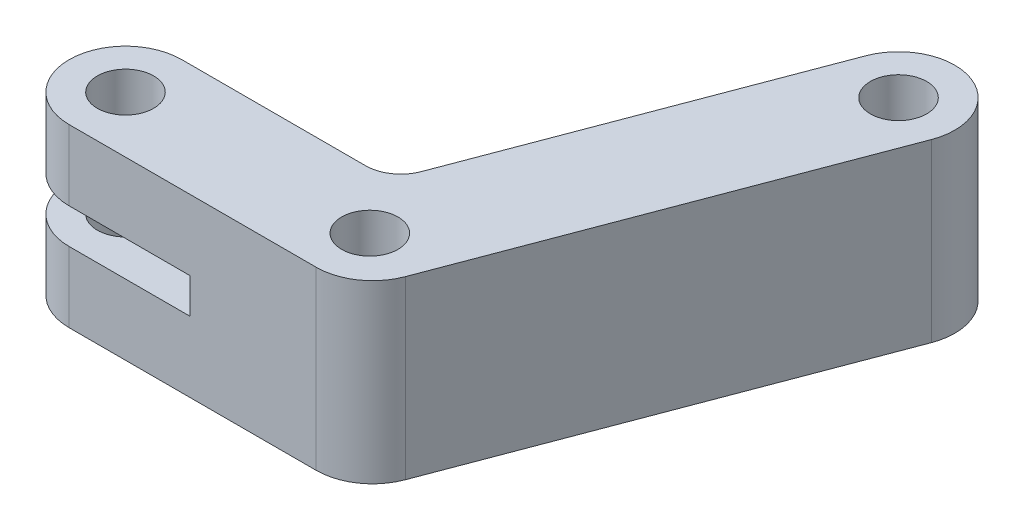
ISO-10303-21;
HEADER;
FILE_DESCRIPTION(('STEP AP214'),'2;1');
FILE_NAME('part.step','',(''),(''),'','','');
FILE_SCHEMA(('AUTOMOTIVE_DESIGN { 1 0 10303 214 1 1 1 1 }'));
ENDSEC;
DATA;
#1=APPLICATION_CONTEXT('core data for automotive mechanical design processes');
#2=APPLICATION_PROTOCOL_DEFINITION('international standard','automotive_design',2000,#1);
#3=PRODUCT_CONTEXT('',#1,'mechanical');
#4=PRODUCT('Part','Part','',(#3));
#5=PRODUCT_RELATED_PRODUCT_CATEGORY('part','',(#4));
#6=PRODUCT_DEFINITION_FORMATION('','',#4);
#7=PRODUCT_DEFINITION_CONTEXT('part definition',#1,'design');
#8=PRODUCT_DEFINITION('design','',#6,#7);
#9=PRODUCT_DEFINITION_SHAPE('','',#8);
#10=(LENGTH_UNIT() NAMED_UNIT(*) SI_UNIT(.MILLI.,.METRE.));
#11=(NAMED_UNIT(*) PLANE_ANGLE_UNIT() SI_UNIT($,.RADIAN.));
#12=(NAMED_UNIT(*) SI_UNIT($,.STERADIAN.) SOLID_ANGLE_UNIT());
#13=UNCERTAINTY_MEASURE_WITH_UNIT(LENGTH_MEASURE(1.E-05),#10,'distance_accuracy_value','');
#14=(GEOMETRIC_REPRESENTATION_CONTEXT(3) GLOBAL_UNCERTAINTY_ASSIGNED_CONTEXT((#13)) GLOBAL_UNIT_ASSIGNED_CONTEXT((#10,
#11,#12)) REPRESENTATION_CONTEXT('',''));
#15=CARTESIAN_POINT('',(0.,0.,0.));
#16=DIRECTION('',(0.,0.,1.));
#17=DIRECTION('',(1.,0.,0.));
#18=AXIS2_PLACEMENT_3D('',#15,#16,#17);
#19=CARTESIAN_POINT('',(0.,25.,-8.));
#20=DIRECTION('',(0.,-1.,0.));
#21=DIRECTION('',(0.,0.,-1.));
#22=AXIS2_PLACEMENT_3D('',#19,#20,#21);
#23=CYLINDRICAL_SURFACE('',#22,8.);
#24=DIRECTION('',(0.,-1.,0.));
#25=VECTOR('',#24,1.);
#26=CARTESIAN_POINT('',(0.,25.,-16.));
#27=LINE('',#26,#25);
#28=CARTESIAN_POINT('',(0.,25.,-16.));
#29=VERTEX_POINT('',#28);
#30=CARTESIAN_POINT('',(0.,15.,-16.));
#31=VERTEX_POINT('',#30);
#32=EDGE_CURVE('E161',#29,#31,#27,.T.);
#33=ORIENTED_EDGE('',*,*,#32,.T.);
#34=CARTESIAN_POINT('',(0.,15.,-8.));
#35=DIRECTION('',(0.,1.,0.));
#36=DIRECTION('',(0.,0.,1.));
#37=AXIS2_PLACEMENT_3D('',#34,#35,#36);
#38=CIRCLE('',#37,8.);
#39=CARTESIAN_POINT('',(0.,15.,0.));
#40=VERTEX_POINT('',#39);
#41=EDGE_CURVE('E188',#31,#40,#38,.T.);
#42=ORIENTED_EDGE('',*,*,#41,.T.);
#43=DIRECTION('',(0.,-1.,0.));
#44=VECTOR('',#43,1.);
#45=CARTESIAN_POINT('',(0.,25.,0.));
#46=LINE('',#45,#44);
#47=CARTESIAN_POINT('',(0.,25.,0.));
#48=VERTEX_POINT('',#47);
#49=EDGE_CURVE('E41',#48,#40,#46,.T.);
#50=ORIENTED_EDGE('',*,*,#49,.F.);
#51=CARTESIAN_POINT('',(0.,25.,-8.));
#52=DIRECTION('',(0.,1.,0.));
#53=DIRECTION('',(0.,0.,1.));
#54=AXIS2_PLACEMENT_3D('',#51,#52,#53);
#55=CIRCLE('',#54,8.);
#56=EDGE_CURVE('E160',#29,#48,#55,.T.);
#57=ORIENTED_EDGE('',*,*,#56,.F.);
#58=EDGE_LOOP('',(#33,#42,#50,#57));
#59=FACE_BOUND('',#58,.T.);
#60=ADVANCED_FACE('F33',(#59),#23,.T.);
#61=CARTESIAN_POINT('',(0.,25.,-8.));
#62=DIRECTION('',(0.,-1.,0.));
#63=DIRECTION('',(0.,0.,-1.));
#64=AXIS2_PLACEMENT_3D('',#61,#62,#63);
#65=CYLINDRICAL_SURFACE('',#64,4.);
#66=CARTESIAN_POINT('',(0.,15.,-8.));
#67=DIRECTION('',(0.,1.,0.));
#68=DIRECTION('',(0.,0.,1.));
#69=AXIS2_PLACEMENT_3D('',#66,#67,#68);
#70=CIRCLE('',#69,4.);
#71=CARTESIAN_POINT('',(0.,15.,-4.));
#72=VERTEX_POINT('',#71);
#73=EDGE_CURVE('E181',#72,#72,#70,.T.);
#74=ORIENTED_EDGE('',*,*,#73,.F.);
#75=EDGE_LOOP('',(#74));
#76=FACE_BOUND('',#75,.T.);
#77=CARTESIAN_POINT('',(0.,25.,-8.));
#78=DIRECTION('',(0.,1.,0.));
#79=DIRECTION('',(0.,0.,1.));
#80=AXIS2_PLACEMENT_3D('',#77,#78,#79);
#81=CIRCLE('',#80,4.);
#82=CARTESIAN_POINT('',(0.,25.,-4.));
#83=VERTEX_POINT('',#82);
#84=EDGE_CURVE('E201',#83,#83,#81,.T.);
#85=ORIENTED_EDGE('',*,*,#84,.T.);
#86=EDGE_LOOP('',(#85));
#87=FACE_BOUND('',#86,.T.);
#88=ADVANCED_FACE('F288',(#76,#87),#65,.F.);
#89=CARTESIAN_POINT('',(0.,25.,-8.));
#90=DIRECTION('',(0.,1.,0.));
#91=DIRECTION('',(0.,0.,1.));
#92=AXIS2_PLACEMENT_3D('',#89,#90,#91);
#93=PLANE('',#92);
#94=CARTESIAN_POINT('',(34.72,25.,-7.99999999999999));
#95=DIRECTION('',(0.,1.,0.));
#96=DIRECTION('',(0.,0.,1.));
#97=AXIS2_PLACEMENT_3D('',#94,#95,#96);
#98=CIRCLE('',#97,4.);
#99=CARTESIAN_POINT('',(34.72,25.,-3.99999999999999));
#100=VERTEX_POINT('',#99);
#101=EDGE_CURVE('E207',#100,#100,#98,.T.);
#102=ORIENTED_EDGE('',*,*,#101,.F.);
#103=EDGE_LOOP('',(#102));
#104=FACE_BOUND('',#103,.T.);
#105=ORIENTED_EDGE('',*,*,#56,.T.);
#106=DIRECTION('',(1.,0.,0.));
#107=VECTOR('',#106,1.);
#108=CARTESIAN_POINT('',(0.,25.,0.));
#109=LINE('',#108,#107);
#110=CARTESIAN_POINT('',(35.1066239380531,25.,0.));
#111=VERTEX_POINT('',#110);
#112=EDGE_CURVE('E100',#48,#111,#109,.T.);
#113=ORIENTED_EDGE('',*,*,#112,.T.);
#114=CARTESIAN_POINT('',(35.1066239380531,25.,-8.));
#115=DIRECTION('',(0.,1.,0.));
#116=DIRECTION('',(0.,0.,1.));
#117=AXIS2_PLACEMENT_3D('',#114,#115,#116);
#118=CIRCLE('',#117,8.);
#119=CARTESIAN_POINT('',(42.5898208472166,25.,-5.17126105504835));
#120=VERTEX_POINT('',#119);
#121=EDGE_CURVE('E219',#111,#120,#118,.T.);
#122=ORIENTED_EDGE('',*,*,#121,.T.);
#123=DIRECTION('',(0.353592368118956,0.,-0.935399613645435));
#124=VECTOR('',#123,1.);
#125=CARTESIAN_POINT('',(42.5898208472166,25.,-5.17126105504835));
#126=LINE('',#125,#124);
#127=CARTESIAN_POINT('',(63.0931969091635,25.,-59.4112610550483));
#128=VERTEX_POINT('',#127);
#129=EDGE_CURVE('E221',#120,#128,#126,.T.);
#130=ORIENTED_EDGE('',*,*,#129,.T.);
#131=CARTESIAN_POINT('',(55.61,25.,-62.24));
#132=DIRECTION('',(0.,1.,0.));
#133=DIRECTION('',(0.,0.,-1.));
#134=AXIS2_PLACEMENT_3D('',#131,#132,#133);
#135=CIRCLE('',#134,8.);
#136=CARTESIAN_POINT('',(48.1268030908365,25.,-65.0687389449516));
#137=VERTEX_POINT('',#136);
#138=EDGE_CURVE('E123',#128,#137,#135,.T.);
#139=ORIENTED_EDGE('',*,*,#138,.T.);
#140=DIRECTION('',(-0.353592368118956,0.,0.935399613645435));
#141=VECTOR('',#140,1.);
#142=CARTESIAN_POINT('',(30.7999757743728,25.,-19.2320381594052));
#143=LINE('',#142,#141);
#144=CARTESIAN_POINT('',(30.7999757743728,25.,-19.2320381594052));
#145=VERTEX_POINT('',#144);
#146=EDGE_CURVE('E115',#137,#145,#143,.T.);
#147=ORIENTED_EDGE('',*,*,#146,.T.);
#148=CARTESIAN_POINT('',(26.1229777061456,25.,-21.));
#149=DIRECTION('',(0.,-1.,0.));
#150=DIRECTION('',(0.,0.,-1.));
#151=AXIS2_PLACEMENT_3D('',#148,#149,#150);
#152=CIRCLE('',#151,5.);
#153=CARTESIAN_POINT('',(26.1229777061456,25.,-16.));
#154=VERTEX_POINT('',#153);
#155=EDGE_CURVE('E120',#145,#154,#152,.T.);
#156=ORIENTED_EDGE('',*,*,#155,.T.);
#157=DIRECTION('',(-1.,0.,0.));
#158=VECTOR('',#157,1.);
#159=CARTESIAN_POINT('',(0.,25.,-16.));
#160=LINE('',#159,#158);
#161=EDGE_CURVE('E57',#154,#29,#160,.T.);
#162=ORIENTED_EDGE('',*,*,#161,.T.);
#163=EDGE_LOOP('',(#105,#113,#122,#130,#139,#147,#156,#162));
#164=FACE_BOUND('',#163,.T.);
#165=CARTESIAN_POINT('',(55.61,25.,-62.24));
#166=DIRECTION('',(0.,1.,0.));
#167=DIRECTION('',(0.,0.,1.));
#168=AXIS2_PLACEMENT_3D('',#165,#166,#167);
#169=CIRCLE('',#168,4.);
#170=CARTESIAN_POINT('',(55.61,25.,-58.24));
#171=VERTEX_POINT('',#170);
#172=EDGE_CURVE('E147',#171,#171,#169,.T.);
#173=ORIENTED_EDGE('',*,*,#172,.F.);
#174=EDGE_LOOP('',(#173));
#175=FACE_BOUND('',#174,.T.);
#176=ORIENTED_EDGE('',*,*,#84,.F.);
#177=EDGE_LOOP('',(#176));
#178=FACE_BOUND('',#177,.T.);
#179=ADVANCED_FACE('F117',(#104,#164,#175,#178),#93,.T.);
#180=CARTESIAN_POINT('',(0.,0.,-8.));
#181=DIRECTION('',(0.,1.,0.));
#182=DIRECTION('',(0.,0.,1.));
#183=AXIS2_PLACEMENT_3D('',#180,#181,#182);
#184=PLANE('',#183);
#185=CARTESIAN_POINT('',(0.,0.,-8.));
#186=DIRECTION('',(0.,1.,0.));
#187=DIRECTION('',(0.,0.,1.));
#188=AXIS2_PLACEMENT_3D('',#185,#186,#187);
#189=CIRCLE('',#188,8.);
#190=CARTESIAN_POINT('',(0.,0.,-16.));
#191=VERTEX_POINT('',#190);
#192=CARTESIAN_POINT('',(0.,0.,0.));
#193=VERTEX_POINT('',#192);
#194=EDGE_CURVE('E144',#191,#193,#189,.T.);
#195=ORIENTED_EDGE('',*,*,#194,.F.);
#196=DIRECTION('',(-1.,0.,0.));
#197=VECTOR('',#196,1.);
#198=CARTESIAN_POINT('',(0.,0.,-16.));
#199=LINE('',#198,#197);
#200=CARTESIAN_POINT('',(26.1229777061456,0.,-16.));
#201=VERTEX_POINT('',#200);
#202=EDGE_CURVE('E158',#201,#191,#199,.T.);
#203=ORIENTED_EDGE('',*,*,#202,.F.);
#204=CARTESIAN_POINT('',(26.1229777061456,0.,-21.));
#205=DIRECTION('',(0.,-1.,0.));
#206=DIRECTION('',(0.,0.,-1.));
#207=AXIS2_PLACEMENT_3D('',#204,#205,#206);
#208=CIRCLE('',#207,5.);
#209=CARTESIAN_POINT('',(30.7999757743728,0.,-19.2320381594052));
#210=VERTEX_POINT('',#209);
#211=EDGE_CURVE('E156',#210,#201,#208,.T.);
#212=ORIENTED_EDGE('',*,*,#211,.F.);
#213=DIRECTION('',(-0.353592368118956,0.,0.935399613645435));
#214=VECTOR('',#213,1.);
#215=CARTESIAN_POINT('',(30.7999757743728,0.,-19.2320381594052));
#216=LINE('',#215,#214);
#217=CARTESIAN_POINT('',(48.1268030908365,0.,-65.0687389449516));
#218=VERTEX_POINT('',#217);
#219=EDGE_CURVE('E132',#218,#210,#216,.T.);
#220=ORIENTED_EDGE('',*,*,#219,.F.);
#221=CARTESIAN_POINT('',(55.61,0.,-62.24));
#222=DIRECTION('',(0.,1.,0.));
#223=DIRECTION('',(0.,0.,-1.));
#224=AXIS2_PLACEMENT_3D('',#221,#222,#223);
#225=CIRCLE('',#224,8.);
#226=CARTESIAN_POINT('',(63.0931969091635,0.,-59.4112610550483));
#227=VERTEX_POINT('',#226);
#228=EDGE_CURVE('E153',#227,#218,#225,.T.);
#229=ORIENTED_EDGE('',*,*,#228,.F.);
#230=DIRECTION('',(0.353592368118956,0.,-0.935399613645435));
#231=VECTOR('',#230,1.);
#232=CARTESIAN_POINT('',(42.5898208472166,0.,-5.17126105504835));
#233=LINE('',#232,#231);
#234=CARTESIAN_POINT('',(42.5898208472166,0.,-5.17126105504835));
#235=VERTEX_POINT('',#234);
#236=EDGE_CURVE('E151',#235,#227,#233,.T.);
#237=ORIENTED_EDGE('',*,*,#236,.F.);
#238=CARTESIAN_POINT('',(35.1066239380531,0.,-8.));
#239=DIRECTION('',(0.,1.,0.));
#240=DIRECTION('',(0.,0.,1.));
#241=AXIS2_PLACEMENT_3D('',#238,#239,#240);
#242=CIRCLE('',#241,8.);
#243=CARTESIAN_POINT('',(35.1066239380531,0.,0.));
#244=VERTEX_POINT('',#243);
#245=EDGE_CURVE('E149',#244,#235,#242,.T.);
#246=ORIENTED_EDGE('',*,*,#245,.F.);
#247=DIRECTION('',(1.,0.,0.));
#248=VECTOR('',#247,1.);
#249=CARTESIAN_POINT('',(0.,0.,0.));
#250=LINE('',#249,#248);
#251=EDGE_CURVE('E146',#193,#244,#250,.T.);
#252=ORIENTED_EDGE('',*,*,#251,.F.);
#253=EDGE_LOOP('',(#195,#203,#212,#220,#229,#237,#246,#252));
#254=FACE_BOUND('',#253,.T.);
#255=CARTESIAN_POINT('',(55.61,0.,-62.24));
#256=DIRECTION('',(0.,1.,0.));
#257=DIRECTION('',(0.,0.,1.));
#258=AXIS2_PLACEMENT_3D('',#255,#256,#257);
#259=CIRCLE('',#258,4.);
#260=CARTESIAN_POINT('',(55.61,0.,-58.24));
#261=VERTEX_POINT('',#260);
#262=EDGE_CURVE('E210',#261,#261,#259,.T.);
#263=ORIENTED_EDGE('',*,*,#262,.T.);
#264=EDGE_LOOP('',(#263));
#265=FACE_BOUND('',#264,.T.);
#266=CARTESIAN_POINT('',(34.72,0.,-7.99999999999999));
#267=DIRECTION('',(0.,1.,0.));
#268=DIRECTION('',(0.,0.,1.));
#269=AXIS2_PLACEMENT_3D('',#266,#267,#268);
#270=CIRCLE('',#269,4.);
#271=CARTESIAN_POINT('',(34.72,0.,-3.99999999999999));
#272=VERTEX_POINT('',#271);
#273=EDGE_CURVE('E204',#272,#272,#270,.T.);
#274=ORIENTED_EDGE('',*,*,#273,.T.);
#275=EDGE_LOOP('',(#274));
#276=FACE_BOUND('',#275,.T.);
#277=CARTESIAN_POINT('',(0.,0.,-8.));
#278=DIRECTION('',(0.,1.,0.));
#279=DIRECTION('',(0.,0.,1.));
#280=AXIS2_PLACEMENT_3D('',#277,#278,#279);
#281=CIRCLE('',#280,4.);
#282=CARTESIAN_POINT('',(0.,0.,-4.));
#283=VERTEX_POINT('',#282);
#284=EDGE_CURVE('E200',#283,#283,#281,.T.);
#285=ORIENTED_EDGE('',*,*,#284,.T.);
#286=EDGE_LOOP('',(#285));
#287=FACE_BOUND('',#286,.T.);
#288=ADVANCED_FACE('F234',(#254,#265,#276,#287),#184,.F.);
#289=CARTESIAN_POINT('',(0.,10.,0.));
#290=VERTEX_POINT('',#289);
#291=EDGE_CURVE('E175',#290,#193,#46,.T.);
#292=ORIENTED_EDGE('',*,*,#291,.F.);
#293=CARTESIAN_POINT('',(0.,10.,-8.));
#294=DIRECTION('',(0.,-1.,0.));
#295=DIRECTION('',(0.,0.,-1.));
#296=AXIS2_PLACEMENT_3D('',#293,#294,#295);
#297=CIRCLE('',#296,8.);
#298=CARTESIAN_POINT('',(0.,10.,-16.));
#299=VERTEX_POINT('',#298);
#300=EDGE_CURVE('E184',#290,#299,#297,.T.);
#301=ORIENTED_EDGE('',*,*,#300,.T.);
#302=EDGE_CURVE('E91',#299,#191,#27,.T.);
#303=ORIENTED_EDGE('',*,*,#302,.T.);
#304=ORIENTED_EDGE('',*,*,#194,.T.);
#305=EDGE_LOOP('',(#292,#301,#303,#304));
#306=FACE_BOUND('',#305,.T.);
#307=ADVANCED_FACE('F35',(#306),#23,.T.);
#308=CARTESIAN_POINT('',(0.,25.,0.));
#309=DIRECTION('',(0.,0.,-1.));
#310=DIRECTION('',(-1.,0.,0.));
#311=AXIS2_PLACEMENT_3D('',#308,#309,#310);
#312=PLANE('',#311);
#313=ORIENTED_EDGE('',*,*,#49,.T.);
#314=DIRECTION('',(-1.,0.,0.));
#315=VECTOR('',#314,1.);
#316=CARTESIAN_POINT('',(-8.,15.,0.));
#317=LINE('',#316,#315);
#318=CARTESIAN_POINT('',(17.15,15.,0.));
#319=VERTEX_POINT('',#318);
#320=EDGE_CURVE('E259',#319,#40,#317,.T.);
#321=ORIENTED_EDGE('',*,*,#320,.F.);
#322=DIRECTION('',(0.,1.,0.));
#323=VECTOR('',#322,1.);
#324=CARTESIAN_POINT('',(17.15,15.,0.));
#325=LINE('',#324,#323);
#326=CARTESIAN_POINT('',(17.15,10.,0.));
#327=VERTEX_POINT('',#326);
#328=EDGE_CURVE('E257',#327,#319,#325,.T.);
#329=ORIENTED_EDGE('',*,*,#328,.F.);
#330=DIRECTION('',(1.,0.,0.));
#331=VECTOR('',#330,1.);
#332=CARTESIAN_POINT('',(-8.,10.,0.));
#333=LINE('',#332,#331);
#334=EDGE_CURVE('E253',#290,#327,#333,.T.);
#335=ORIENTED_EDGE('',*,*,#334,.F.);
#336=ORIENTED_EDGE('',*,*,#291,.T.);
#337=ORIENTED_EDGE('',*,*,#251,.T.);
#338=DIRECTION('',(0.,-1.,0.));
#339=VECTOR('',#338,1.);
#340=CARTESIAN_POINT('',(35.1066239380531,25.,0.));
#341=LINE('',#340,#339);
#342=EDGE_CURVE('E172',#111,#244,#341,.T.);
#343=ORIENTED_EDGE('',*,*,#342,.F.);
#344=ORIENTED_EDGE('',*,*,#112,.F.);
#345=EDGE_LOOP('',(#313,#321,#329,#335,#336,#337,#343,#344));
#346=FACE_BOUND('',#345,.T.);
#347=ADVANCED_FACE('F243',(#346),#312,.F.);
#348=CARTESIAN_POINT('',(35.1066239380531,25.,-8.));
#349=DIRECTION('',(0.,-1.,0.));
#350=DIRECTION('',(0.,0.,-1.));
#351=AXIS2_PLACEMENT_3D('',#348,#349,#350);
#352=CYLINDRICAL_SURFACE('',#351,8.);
#353=ORIENTED_EDGE('',*,*,#245,.T.);
#354=DIRECTION('',(0.,-1.,0.));
#355=VECTOR('',#354,1.);
#356=CARTESIAN_POINT('',(42.5898208472166,25.,-5.17126105504835));
#357=LINE('',#356,#355);
#358=EDGE_CURVE('E169',#120,#235,#357,.T.);
#359=ORIENTED_EDGE('',*,*,#358,.F.);
#360=ORIENTED_EDGE('',*,*,#121,.F.);
#361=ORIENTED_EDGE('',*,*,#342,.T.);
#362=EDGE_LOOP('',(#353,#359,#360,#361));
#363=FACE_BOUND('',#362,.T.);
#364=ADVANCED_FACE('F247',(#363),#352,.T.);
#365=CARTESIAN_POINT('',(42.5898208472166,25.,-5.17126105504835));
#366=DIRECTION('',(-0.935399613645435,0.,-0.353592368118956));
#367=DIRECTION('',(-0.353592368118956,0.,0.935399613645435));
#368=AXIS2_PLACEMENT_3D('',#365,#366,#367);
#369=PLANE('',#368);
#370=ORIENTED_EDGE('',*,*,#236,.T.);
#371=DIRECTION('',(0.,-1.,0.));
#372=VECTOR('',#371,1.);
#373=CARTESIAN_POINT('',(63.0931969091635,25.,-59.4112610550483));
#374=LINE('',#373,#372);
#375=EDGE_CURVE('E166',#128,#227,#374,.T.);
#376=ORIENTED_EDGE('',*,*,#375,.F.);
#377=ORIENTED_EDGE('',*,*,#129,.F.);
#378=ORIENTED_EDGE('',*,*,#358,.T.);
#379=EDGE_LOOP('',(#370,#376,#377,#378));
#380=FACE_BOUND('',#379,.T.);
#381=ADVANCED_FACE('F227',(#380),#369,.F.);
#382=CARTESIAN_POINT('',(55.61,25.,-62.24));
#383=DIRECTION('',(0.,-1.,0.));
#384=DIRECTION('',(0.,0.,-1.));
#385=AXIS2_PLACEMENT_3D('',#382,#383,#384);
#386=CYLINDRICAL_SURFACE('',#385,8.);
#387=ORIENTED_EDGE('',*,*,#228,.T.);
#388=DIRECTION('',(0.,-1.,0.));
#389=VECTOR('',#388,1.);
#390=CARTESIAN_POINT('',(48.1268030908365,25.,-65.0687389449516));
#391=LINE('',#390,#389);
#392=EDGE_CURVE('E135',#137,#218,#391,.T.);
#393=ORIENTED_EDGE('',*,*,#392,.F.);
#394=ORIENTED_EDGE('',*,*,#138,.F.);
#395=ORIENTED_EDGE('',*,*,#375,.T.);
#396=EDGE_LOOP('',(#387,#393,#394,#395));
#397=FACE_BOUND('',#396,.T.);
#398=ADVANCED_FACE('F231',(#397),#386,.T.);
#399=CARTESIAN_POINT('',(30.7999757743728,25.,-19.2320381594052));
#400=DIRECTION('',(0.935399613645435,0.,0.353592368118956));
#401=DIRECTION('',(0.353592368118956,0.,-0.935399613645435));
#402=AXIS2_PLACEMENT_3D('',#399,#400,#401);
#403=PLANE('',#402);
#404=ORIENTED_EDGE('',*,*,#219,.T.);
#405=DIRECTION('',(0.,-1.,0.));
#406=VECTOR('',#405,1.);
#407=CARTESIAN_POINT('',(30.7999757743728,25.,-19.2320381594052));
#408=LINE('',#407,#406);
#409=EDGE_CURVE('E129',#145,#210,#408,.T.);
#410=ORIENTED_EDGE('',*,*,#409,.F.);
#411=ORIENTED_EDGE('',*,*,#146,.F.);
#412=ORIENTED_EDGE('',*,*,#392,.T.);
#413=EDGE_LOOP('',(#404,#410,#411,#412));
#414=FACE_BOUND('',#413,.T.);
#415=ADVANCED_FACE('F130',(#414),#403,.F.);
#416=CARTESIAN_POINT('',(26.1229777061456,25.,-21.));
#417=DIRECTION('',(0.,-1.,0.));
#418=DIRECTION('',(0.,0.,-1.));
#419=AXIS2_PLACEMENT_3D('',#416,#417,#418);
#420=CYLINDRICAL_SURFACE('',#419,5.);
#421=ORIENTED_EDGE('',*,*,#211,.T.);
#422=DIRECTION('',(0.,-1.,0.));
#423=VECTOR('',#422,1.);
#424=CARTESIAN_POINT('',(26.1229777061456,25.,-16.));
#425=LINE('',#424,#423);
#426=EDGE_CURVE('E136',#154,#201,#425,.T.);
#427=ORIENTED_EDGE('',*,*,#426,.F.);
#428=ORIENTED_EDGE('',*,*,#155,.F.);
#429=ORIENTED_EDGE('',*,*,#409,.T.);
#430=EDGE_LOOP('',(#421,#427,#428,#429));
#431=FACE_BOUND('',#430,.T.);
#432=ADVANCED_FACE('F138',(#431),#420,.F.);
#433=CARTESIAN_POINT('',(0.,25.,-16.));
#434=DIRECTION('',(0.,0.,1.));
#435=DIRECTION('',(1.,0.,0.));
#436=AXIS2_PLACEMENT_3D('',#433,#434,#435);
#437=PLANE('',#436);
#438=DIRECTION('',(0.,1.,0.));
#439=VECTOR('',#438,1.);
#440=CARTESIAN_POINT('',(17.15,25.,-16.));
#441=LINE('',#440,#439);
#442=CARTESIAN_POINT('',(17.15,10.,-16.));
#443=VERTEX_POINT('',#442);
#444=CARTESIAN_POINT('',(17.15,15.,-16.));
#445=VERTEX_POINT('',#444);
#446=EDGE_CURVE('E11',#443,#445,#441,.T.);
#447=ORIENTED_EDGE('',*,*,#446,.T.);
#448=DIRECTION('',(-1.,0.,0.));
#449=VECTOR('',#448,1.);
#450=CARTESIAN_POINT('',(0.,15.,-16.));
#451=LINE('',#450,#449);
#452=EDGE_CURVE('E183',#445,#31,#451,.T.);
#453=ORIENTED_EDGE('',*,*,#452,.T.);
#454=ORIENTED_EDGE('',*,*,#32,.F.);
#455=ORIENTED_EDGE('',*,*,#161,.F.);
#456=ORIENTED_EDGE('',*,*,#426,.T.);
#457=ORIENTED_EDGE('',*,*,#202,.T.);
#458=ORIENTED_EDGE('',*,*,#302,.F.);
#459=DIRECTION('',(1.,0.,0.));
#460=VECTOR('',#459,1.);
#461=CARTESIAN_POINT('',(0.,10.,-16.));
#462=LINE('',#461,#460);
#463=EDGE_CURVE('E179',#299,#443,#462,.T.);
#464=ORIENTED_EDGE('',*,*,#463,.T.);
#465=EDGE_LOOP('',(#447,#453,#454,#455,#456,#457,#458,#464));
#466=FACE_BOUND('',#465,.T.);
#467=ADVANCED_FACE('F238',(#466),#437,.F.);
#468=CARTESIAN_POINT('',(55.61,25.,-62.24));
#469=DIRECTION('',(0.,-1.,0.));
#470=DIRECTION('',(0.,0.,-1.));
#471=AXIS2_PLACEMENT_3D('',#468,#469,#470);
#472=CYLINDRICAL_SURFACE('',#471,4.);
#473=ORIENTED_EDGE('',*,*,#172,.T.);
#474=EDGE_LOOP('',(#473));
#475=FACE_BOUND('',#474,.T.);
#476=ORIENTED_EDGE('',*,*,#262,.F.);
#477=EDGE_LOOP('',(#476));
#478=FACE_BOUND('',#477,.T.);
#479=ADVANCED_FACE('F309',(#475,#478),#472,.F.);
#480=CARTESIAN_POINT('',(34.72,25.,-7.99999999999999));
#481=DIRECTION('',(0.,-1.,0.));
#482=DIRECTION('',(0.,0.,-1.));
#483=AXIS2_PLACEMENT_3D('',#480,#481,#482);
#484=CYLINDRICAL_SURFACE('',#483,4.);
#485=ORIENTED_EDGE('',*,*,#101,.T.);
#486=EDGE_LOOP('',(#485));
#487=FACE_BOUND('',#486,.T.);
#488=ORIENTED_EDGE('',*,*,#273,.F.);
#489=EDGE_LOOP('',(#488));
#490=FACE_BOUND('',#489,.T.);
#491=ADVANCED_FACE('F350',(#487,#490),#484,.F.);
#492=CARTESIAN_POINT('',(0.,10.,-8.));
#493=DIRECTION('',(0.,-1.,0.));
#494=DIRECTION('',(0.,0.,-1.));
#495=AXIS2_PLACEMENT_3D('',#492,#493,#494);
#496=CIRCLE('',#495,4.);
#497=CARTESIAN_POINT('',(0.,10.,-12.));
#498=VERTEX_POINT('',#497);
#499=EDGE_CURVE('E177',#498,#498,#496,.T.);
#500=ORIENTED_EDGE('',*,*,#499,.F.);
#501=EDGE_LOOP('',(#500));
#502=FACE_BOUND('',#501,.T.);
#503=ORIENTED_EDGE('',*,*,#284,.F.);
#504=EDGE_LOOP('',(#503));
#505=FACE_BOUND('',#504,.T.);
#506=ADVANCED_FACE('F293',(#502,#505),#65,.F.);
#507=CARTESIAN_POINT('',(17.15,15.,-20.));
#508=DIRECTION('',(1.,0.,0.));
#509=DIRECTION('',(0.,0.,-1.));
#510=AXIS2_PLACEMENT_3D('',#507,#508,#509);
#511=PLANE('',#510);
#512=DIRECTION('',(0.,0.,1.));
#513=VECTOR('',#512,1.);
#514=CARTESIAN_POINT('',(17.15,10.,-20.));
#515=LINE('',#514,#513);
#516=EDGE_CURVE('E48',#443,#327,#515,.T.);
#517=ORIENTED_EDGE('',*,*,#516,.T.);
#518=ORIENTED_EDGE('',*,*,#328,.T.);
#519=DIRECTION('',(0.,0.,1.));
#520=VECTOR('',#519,1.);
#521=CARTESIAN_POINT('',(17.15,15.,-20.));
#522=LINE('',#521,#520);
#523=EDGE_CURVE('E180',#445,#319,#522,.T.);
#524=ORIENTED_EDGE('',*,*,#523,.F.);
#525=ORIENTED_EDGE('',*,*,#446,.F.);
#526=EDGE_LOOP('',(#517,#518,#524,#525));
#527=FACE_BOUND('',#526,.T.);
#528=ADVANCED_FACE('F266',(#527),#511,.F.);
#529=CARTESIAN_POINT('',(-8.,15.,-20.));
#530=DIRECTION('',(0.,1.,0.));
#531=DIRECTION('',(0.,0.,1.));
#532=AXIS2_PLACEMENT_3D('',#529,#530,#531);
#533=PLANE('',#532);
#534=ORIENTED_EDGE('',*,*,#73,.T.);
#535=EDGE_LOOP('',(#534));
#536=FACE_BOUND('',#535,.T.);
#537=ORIENTED_EDGE('',*,*,#41,.F.);
#538=ORIENTED_EDGE('',*,*,#452,.F.);
#539=ORIENTED_EDGE('',*,*,#523,.T.);
#540=ORIENTED_EDGE('',*,*,#320,.T.);
#541=EDGE_LOOP('',(#537,#538,#539,#540));
#542=FACE_BOUND('',#541,.T.);
#543=ADVANCED_FACE('F276',(#536,#542),#533,.F.);
#544=CARTESIAN_POINT('',(-8.,10.,-20.));
#545=DIRECTION('',(0.,-1.,0.));
#546=DIRECTION('',(0.,0.,-1.));
#547=AXIS2_PLACEMENT_3D('',#544,#545,#546);
#548=PLANE('',#547);
#549=ORIENTED_EDGE('',*,*,#499,.T.);
#550=EDGE_LOOP('',(#549));
#551=FACE_BOUND('',#550,.T.);
#552=ORIENTED_EDGE('',*,*,#334,.T.);
#553=ORIENTED_EDGE('',*,*,#516,.F.);
#554=ORIENTED_EDGE('',*,*,#463,.F.);
#555=ORIENTED_EDGE('',*,*,#300,.F.);
#556=EDGE_LOOP('',(#552,#553,#554,#555));
#557=FACE_BOUND('',#556,.T.);
#558=ADVANCED_FACE('F277',(#551,#557),#548,.F.);
#559=CLOSED_SHELL('',(#60,#88,#179,#288,#307,#347,#364,#381,#398,#415,#432,#467,#479,#491,#506,
#528,#543,#558));
#560=MANIFOLD_SOLID_BREP('B2',#559);
#561=ADVANCED_BREP_SHAPE_REPRESENTATION('',(#18,#560),#14);
#562=SHAPE_DEFINITION_REPRESENTATION(#9,#561);
ENDSEC;
END-ISO-10303-21;
